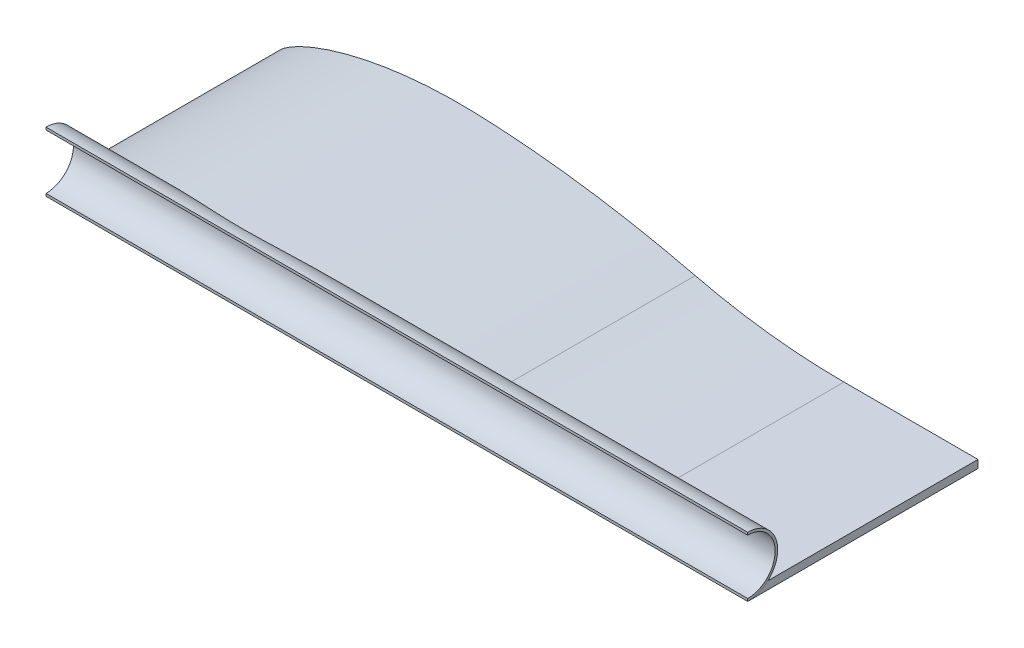
ISO-10303-21;
HEADER;
FILE_DESCRIPTION(('STEP AP214'),'2;1');
FILE_NAME('part.step','',(''),(''),'','','');
FILE_SCHEMA(('AUTOMOTIVE_DESIGN { 1 0 10303 214 1 1 1 1 }'));
ENDSEC;
DATA;
#1=APPLICATION_CONTEXT('core data for automotive mechanical design processes');
#2=APPLICATION_PROTOCOL_DEFINITION('international standard','automotive_design',2000,#1);
#3=PRODUCT_CONTEXT('',#1,'mechanical');
#4=PRODUCT('Part','Part','',(#3));
#5=PRODUCT_RELATED_PRODUCT_CATEGORY('part','',(#4));
#6=PRODUCT_DEFINITION_FORMATION('','',#4);
#7=PRODUCT_DEFINITION_CONTEXT('part definition',#1,'design');
#8=PRODUCT_DEFINITION('design','',#6,#7);
#9=PRODUCT_DEFINITION_SHAPE('','',#8);
#10=(LENGTH_UNIT() NAMED_UNIT(*) SI_UNIT(.MILLI.,.METRE.));
#11=(NAMED_UNIT(*) PLANE_ANGLE_UNIT() SI_UNIT($,.RADIAN.));
#12=(NAMED_UNIT(*) SI_UNIT($,.STERADIAN.) SOLID_ANGLE_UNIT());
#13=UNCERTAINTY_MEASURE_WITH_UNIT(LENGTH_MEASURE(1.E-05),#10,'distance_accuracy_value','');
#14=(GEOMETRIC_REPRESENTATION_CONTEXT(3) GLOBAL_UNCERTAINTY_ASSIGNED_CONTEXT((#13)) GLOBAL_UNIT_ASSIGNED_CONTEXT((#10,
#11,#12)) REPRESENTATION_CONTEXT('',''));
#15=CARTESIAN_POINT('',(0.,0.,0.));
#16=DIRECTION('',(0.,0.,1.));
#17=DIRECTION('',(1.,0.,0.));
#18=AXIS2_PLACEMENT_3D('',#15,#16,#17);
#19=CARTESIAN_POINT('',(0.,0.,185.42));
#20=DIRECTION('',(0.,0.,1.));
#21=DIRECTION('',(1.,0.,0.));
#22=AXIS2_PLACEMENT_3D('',#19,#20,#21);
#23=PLANE('',#22);
#24=DIRECTION('',(1.,0.,0.));
#25=VECTOR('',#24,1.);
#26=CARTESIAN_POINT('',(-52.6289643327547,-1.55200593643312,185.42));
#27=LINE('',#26,#25);
#28=CARTESIAN_POINT('',(-1.16956159429626,-1.55200593643312,185.42));
#29=VERTEX_POINT('',#28);
#30=CARTESIAN_POINT('',(563.880012,-1.55200593643312,185.42));
#31=VERTEX_POINT('',#30);
#32=EDGE_CURVE('E105',#29,#31,#27,.T.);
#33=ORIENTED_EDGE('',*,*,#32,.F.);
#34=DIRECTION('',(0.,1.,0.));
#35=VECTOR('',#34,1.);
#36=CARTESIAN_POINT('',(-1.16956159429626,0.,185.42));
#37=LINE('',#36,#35);
#38=CARTESIAN_POINT('',(-1.16956159429626,-3.58400593643312,185.42));
#39=VERTEX_POINT('',#38);
#40=EDGE_CURVE('E194',#39,#29,#37,.T.);
#41=ORIENTED_EDGE('',*,*,#40,.F.);
#42=DIRECTION('',(1.,0.,0.));
#43=VECTOR('',#42,1.);
#44=CARTESIAN_POINT('',(-1.16956159429626,-3.58400593643312,185.42));
#45=LINE('',#44,#43);
#46=CARTESIAN_POINT('',(16.8244862805456,-3.58400593643312,185.42));
#47=VERTEX_POINT('',#46);
#48=EDGE_CURVE('E190',#39,#47,#45,.T.);
#49=ORIENTED_EDGE('',*,*,#48,.T.);
#50=DIRECTION('',(1.,0.,0.));
#51=VECTOR('',#50,1.);
#52=CARTESIAN_POINT('',(0.,-3.58400593643312,185.42));
#53=LINE('',#52,#51);
#54=CARTESIAN_POINT('',(563.880006,-3.58400593643313,185.42));
#55=VERTEX_POINT('',#54);
#56=EDGE_CURVE('E125',#47,#55,#53,.T.);
#57=ORIENTED_EDGE('',*,*,#56,.T.);
#58=DIRECTION('',(0.,1.,0.));
#59=VECTOR('',#58,1.);
#60=CARTESIAN_POINT('',(563.880012,0.,185.42));
#61=LINE('',#60,#59);
#62=EDGE_CURVE('E119',#55,#31,#61,.T.);
#63=ORIENTED_EDGE('',*,*,#62,.T.);
#64=EDGE_LOOP('',(#33,#41,#49,#57,#63));
#65=FACE_BOUND('',#64,.T.);
#66=ADVANCED_FACE('F35',(#65),#23,.T.);
#67=CARTESIAN_POINT('',(0.,2.76599406356662,185.42));
#68=DIRECTION('',(0.,-1.,0.));
#69=DIRECTION('',(1.,0.,0.));
#70=AXIS2_PLACEMENT_3D('',#67,#68,#69);
#71=PLANE('',#70);
#72=DIRECTION('',(1.,0.,0.));
#73=VECTOR('',#72,1.);
#74=CARTESIAN_POINT('',(-1.16956159429626,2.76599406356663,169.106554625096));
#75=LINE('',#74,#73);
#76=CARTESIAN_POINT('',(563.88,2.76599406356663,169.106554625096));
#77=VERTEX_POINT('',#76);
#78=CARTESIAN_POINT('',(455.986702340772,2.76599406356692,169.106554625095));
#79=VERTEX_POINT('',#78);
#80=EDGE_CURVE('E129',#77,#79,#75,.F.);
#81=ORIENTED_EDGE('',*,*,#80,.F.);
#82=DIRECTION('',(0.,0.,-1.));
#83=VECTOR('',#82,1.);
#84=CARTESIAN_POINT('',(563.88,2.76599406356688,185.42));
#85=LINE('',#84,#83);
#86=CARTESIAN_POINT('',(563.88,2.76599406356688,0.));
#87=VERTEX_POINT('',#86);
#88=EDGE_CURVE('E220',#77,#87,#85,.T.);
#89=ORIENTED_EDGE('',*,*,#88,.T.);
#90=DIRECTION('',(-1.,0.,0.));
#91=VECTOR('',#90,1.);
#92=CARTESIAN_POINT('',(0.,2.76599406356662,0.));
#93=LINE('',#92,#91);
#94=CARTESIAN_POINT('',(455.986702340772,2.76599406356683,0.));
#95=VERTEX_POINT('',#94);
#96=EDGE_CURVE('E142',#87,#95,#93,.T.);
#97=ORIENTED_EDGE('',*,*,#96,.T.);
#98=DIRECTION('',(0.,0.,1.));
#99=VECTOR('',#98,1.);
#100=CARTESIAN_POINT('',(455.986702340772,2.76599406356683,185.42));
#101=LINE('',#100,#99);
#102=EDGE_CURVE('E215',#95,#79,#101,.T.);
#103=ORIENTED_EDGE('',*,*,#102,.T.);
#104=EDGE_LOOP('',(#81,#89,#97,#103));
#105=FACE_BOUND('',#104,.T.);
#106=ADVANCED_FACE('F153',(#105),#71,.F.);
#107=CARTESIAN_POINT('',(397.402740733893,0.,185.42));
#108=CARTESIAN_POINT('',(397.411698055032,0.038885320403436,185.42));
#109=CARTESIAN_POINT('',(395.109063505421,0.667730492670391,185.42));
#110=CARTESIAN_POINT('',(392.784748718469,1.49199113491221,185.42));
#111=CARTESIAN_POINT('',(387.041714069542,3.20797201327392,185.42));
#112=CARTESIAN_POINT('',(379.954865000334,5.35658969865723,185.42));
#113=CARTESIAN_POINT('',(370.615780699372,8.05897955921893,185.42));
#114=CARTESIAN_POINT('',(359.507412748466,11.1431063312715,185.42));
#115=CARTESIAN_POINT('',(346.598869357543,14.5438713747355,185.42));
#116=CARTESIAN_POINT('',(332.061103090113,18.1288417989651,185.42));
#117=CARTESIAN_POINT('',(316.038892879882,21.8064155050036,185.42));
#118=CARTESIAN_POINT('',(298.691944357754,25.449886624153,185.42));
#119=CARTESIAN_POINT('',(280.209065946268,28.9588443293727,185.42));
#120=CARTESIAN_POINT('',(260.784413321996,32.2270252294116,185.42));
#121=CARTESIAN_POINT('',(240.627196048796,35.1598340983636,185.42));
#122=CARTESIAN_POINT('',(219.959471218607,37.67781805282,185.42));
#123=CARTESIAN_POINT('',(199.01149733823,39.7118853380755,185.42));
#124=CARTESIAN_POINT('',(178.012037109444,41.1804944444643,185.42));
#125=CARTESIAN_POINT('',(157.089436587516,42.139263372195,185.42));
#126=CARTESIAN_POINT('',(136.464680266551,42.2131749394883,185.42));
#127=CARTESIAN_POINT('',(116.414649466667,41.217940478165,185.42));
#128=CARTESIAN_POINT('',(97.30433097571,39.2984877838289,185.42));
#129=CARTESIAN_POINT('',(79.3799866186788,36.5495213442708,185.42));
#130=CARTESIAN_POINT('',(62.8681190648392,33.1147834871376,185.42));
#131=CARTESIAN_POINT('',(47.9655542938233,29.1739071161229,185.42));
#132=CARTESIAN_POINT('',(34.850979219968,24.8995128608497,185.42));
#133=CARTESIAN_POINT('',(23.6592605092071,20.5034094565773,185.42));
#134=CARTESIAN_POINT('',(14.5152980764796,16.1324942141789,185.42));
#135=CARTESIAN_POINT('',(7.44822395064549,12.0104976420917,185.42));
#136=CARTESIAN_POINT('',(2.54712627731124,8.16899422843115,185.42));
#137=CARTESIAN_POINT('',(-0.453384309126816,4.79279174210024,185.42));
#138=CARTESIAN_POINT('',(-1.16956159429625,1.10557529626499,185.42));
#139=CARTESIAN_POINT('',(1.41486830061476,-1.60410388651566,185.42));
#140=CARTESIAN_POINT('',(5.70098263570552,-2.84077269687765,185.42));
#141=CARTESIAN_POINT('',(11.7555244989561,-3.57445206902531,185.42));
#142=CARTESIAN_POINT('',(19.6987641608015,-3.6327457960979,185.42));
#143=CARTESIAN_POINT('',(29.4506872946603,-3.17318046215981,185.42));
#144=CARTESIAN_POINT('',(40.9133147322604,-2.23102229721433,185.42));
#145=CARTESIAN_POINT('',(53.9547343819028,-0.933620653111706,185.42));
#146=CARTESIAN_POINT('',(68.4418443218216,0.603641828697804,185.42));
#147=CARTESIAN_POINT('',(84.2200775935775,2.26179395625605,185.42));
#148=CARTESIAN_POINT('',(101.146412331284,3.90001725460771,185.42));
#149=CARTESIAN_POINT('',(119.057408579271,5.37100954783997,185.42));
#150=CARTESIAN_POINT('',(137.798850975262,6.57353185564482,185.42));
#151=CARTESIAN_POINT('',(157.307672245746,7.34803820882025,185.42));
#152=CARTESIAN_POINT('',(177.401590339587,7.7535348034742,185.42));
#153=CARTESIAN_POINT('',(197.867291710901,8.10629507872485,185.42));
#154=CARTESIAN_POINT('',(218.383935910607,8.25382990528894,185.42));
#155=CARTESIAN_POINT('',(238.720913992722,8.21180933346506,185.42));
#156=CARTESIAN_POINT('',(258.65927683326,7.95581265533055,185.42));
#157=CARTESIAN_POINT('',(277.981187946263,7.50085728926565,185.42));
#158=CARTESIAN_POINT('',(296.474222895194,6.86319583158048,185.42));
#159=CARTESIAN_POINT('',(313.932531106465,6.08399675056258,185.42));
#160=CARTESIAN_POINT('',(330.158311416149,5.19874258601101,185.42));
#161=CARTESIAN_POINT('',(344.958833394524,4.26578253175616,185.42));
#162=CARTESIAN_POINT('',(358.177232855869,3.32463445264578,185.42));
#163=CARTESIAN_POINT('',(369.605973842651,2.44215040704408,185.42));
#164=CARTESIAN_POINT('',(379.256357552193,1.63364963837423,185.42));
#165=CARTESIAN_POINT('',(386.613193972221,1.00338863630718,185.42));
#166=CARTESIAN_POINT('',(392.568540150879,0.420302648445525,185.42));
#167=CARTESIAN_POINT('',(395.032189851431,0.277232580315452,185.42));
#168=CARTESIAN_POINT('',(397.393838715057,-0.0386452432959012,185.42));
#169=CARTESIAN_POINT('',(397.402740733893,0.,185.42));
#170=B_SPLINE_CURVE_WITH_KNOTS('',3,(#107,#108,#109,#110,#111,#112,#113,#114,#115,#116,#117,
#118,#119,#120,#121,#122,#123,#124,#125,#126,#127,#128,#129,#130,#131,#132,#133,#134,#135,#136,
#137,#138,#139,#140,#141,#142,#143,#144,#145,#146,#147,#148,#149,#150,#151,#152,#153,#154,#155,
#156,#157,#158,#159,#160,#161,#162,#163,#164,#165,#166,#167,#168,#169),.UNSPECIFIED.,.T.,.F.,(4,
1,1,1,1,1,1,1,1,1,1,1,1,1,1,1,1,1,1,1,1,1,1,1,1,1,1,1,1,1,1,1,1,1,1,1,1,1,1,1,1,1,1,1,1,1,1,1,1,
1,1,1,1,1,1,1,1,1,1,1,4),(0.,0.00137455348322331,0.00548449728179396,0.0122733609908927,
0.021682195504866,0.0335806119079948,0.0478307427867091,0.0643059527211734,0.082777332043007,
0.103063756455997,0.124929016786915,0.148149110667858,0.172444694611559,0.197572105868171,
0.223268880537162,0.249227774933554,0.275186209349679,0.300900708934774,0.326462938278696,
0.351222485186767,0.374905858971967,0.397269706218861,0.418072413969665,0.437079533175026,
0.454093093767394,0.468919631578705,0.48139171235289,0.491447126518173,0.499023571234557,
0.504293734329401,0.507921918342,0.511539686153778,0.516780527527172,0.524216490268905,
0.533991629403711,0.546033957270731,0.560220284382465,0.576403357410148,0.594370816485922,
0.613951103581465,0.634916884969972,0.657088503485648,0.680229909573905,0.704175481107386,
0.72909036740664,0.754353775526935,0.779667752347888,0.804760119952374,0.829359338708984,
0.853208710008459,0.876041363199166,0.897604065496152,0.917662212410958,0.935969860405553,
0.952309787739252,0.966502759006892,0.978350082728452,0.987731492337842,0.994510920242662,
0.998633932979557,1.),.UNSPECIFIED.);
#171=DIRECTION('',(0.,0.,-1.));
#172=VECTOR('',#171,1.);
#173=SURFACE_OF_LINEAR_EXTRUSION('',#170,#172);
#174=CARTESIAN_POINT('',(336.21803103568,17.0864771967916,161.539283029011));
#175=CARTESIAN_POINT('',(335.437780249943,17.2757644204646,161.511863534873));
#176=CARTESIAN_POINT('',(334.657214541211,17.464093103482,161.486876790603));
#177=CARTESIAN_POINT('',(333.095490141557,17.8388368753126,161.441596352543));
#178=CARTESIAN_POINT('',(332.314331452396,18.0252519697809,161.42130264488));
#179=CARTESIAN_POINT('',(329.969668457196,18.5817158477031,161.367194202811));
#180=CARTESIAN_POINT('',(328.405322557292,18.9488994591967,161.34016413168));
#181=CARTESIAN_POINT('',(325.274298396243,19.6754861046501,161.302963173165));
#182=CARTESIAN_POINT('',(323.707619725699,20.0348875421759,161.292795713236));
#183=CARTESIAN_POINT('',(320.572171296696,20.7457180526098,161.288208846348));
#184=CARTESIAN_POINT('',(319.003401244768,21.0971458458174,161.293791949446));
#185=CARTESIAN_POINT('',(315.864013538494,21.7918122816116,161.319674909328));
#186=CARTESIAN_POINT('',(314.293395719207,22.1350501239534,161.339976198201));
#187=CARTESIAN_POINT('',(311.141886800089,22.8151773024117,161.394498203908));
#188=CARTESIAN_POINT('',(309.560987134852,23.1520207292931,161.428795686285));
#189=CARTESIAN_POINT('',(306.397858783431,23.8174039442358,161.510438770316));
#190=CARTESIAN_POINT('',(304.815630163918,24.1459441258268,161.557783752318));
#191=CARTESIAN_POINT('',(301.650104291215,24.7947314517675,161.66472255779));
#192=CARTESIAN_POINT('',(300.066807204176,25.1149796713707,161.724314784062));
#193=CARTESIAN_POINT('',(296.89940616505,25.7471889334054,161.855012628208));
#194=CARTESIAN_POINT('',(295.315302474069,26.0591518210569,161.926115657062));
#195=CARTESIAN_POINT('',(292.146532218502,26.6747000738358,162.079125797354));
#196=CARTESIAN_POINT('',(290.561866009426,26.9782881555916,162.161029354265));
#197=CARTESIAN_POINT('',(287.19448059099,27.6143599486085,162.345815320785));
#198=CARTESIAN_POINT('',(285.411627483541,27.9457447495862,162.450039952394));
#199=CARTESIAN_POINT('',(281.84469517669,28.597922590884,162.670454259723));
#200=CARTESIAN_POINT('',(280.060615958891,28.9187154685767,162.786644119045));
#201=CARTESIAN_POINT('',(276.491336141932,29.5496379793594,163.030144886648));
#202=CARTESIAN_POINT('',(274.706135538111,29.8597675678198,163.157455841467));
#203=CARTESIAN_POINT('',(267.56439866628,31.0786416986717,163.687215764119));
#204=CARTESIAN_POINT('',(262.20344871317,31.9445554313976,164.130863834038));
#205=CARTESIAN_POINT('',(255.049349438321,33.0339672147566,164.770371265855));
#206=CARTESIAN_POINT('',(253.259752555489,33.30097169105,164.934299779345));
#207=CARTESIAN_POINT('',(249.679627756892,33.824063115189,165.269410028223));
#208=CARTESIAN_POINT('',(247.889099840435,34.0801500549142,165.440591769007));
#209=CARTESIAN_POINT('',(244.307146367711,34.5813595143561,165.789446258636));
#210=CARTESIAN_POINT('',(242.5157208113,34.8264820323191,165.967119008521));
#211=CARTESIAN_POINT('',(238.93024398061,35.3059515824793,166.328359643428));
#212=CARTESIAN_POINT('',(237.13619184107,35.5402879835165,166.511933054049));
#213=CARTESIAN_POINT('',(233.547180237933,35.9978457415093,166.883977716382));
#214=CARTESIAN_POINT('',(231.752220774891,36.2210671052663,167.072448965096));
#215=CARTESIAN_POINT('',(228.16137018703,36.6563063880655,167.453409476521));
#216=CARTESIAN_POINT('',(226.365479062006,36.8683243046453,167.645898740114));
#217=CARTESIAN_POINT('',(222.770246011707,37.2813606585816,168.034233796462));
#218=CARTESIAN_POINT('',(220.970902752225,37.482363453226,168.230083869195));
#219=CARTESIAN_POINT('',(217.371201905939,37.8729401695694,168.623848231668));
#220=CARTESIAN_POINT('',(215.570844319171,38.0625140916829,168.821762521331));
#221=CARTESIAN_POINT('',(211.969011243518,38.4299433460895,169.218323262522));
#222=CARTESIAN_POINT('',(210.167535752775,38.6077986588607,169.416969715268));
#223=CARTESIAN_POINT('',(206.560162704245,38.9518176947632,169.813859278725));
#224=CARTESIAN_POINT('',(204.75426296622,39.1179601478332,170.012101051496));
#225=CARTESIAN_POINT('',(202.04439918073,39.3579348607536,170.307624158379));
#226=CARTESIAN_POINT('',(201.140942642942,39.4363865696056,170.405825223379));
#227=CARTESIAN_POINT('',(199.333670786919,39.5901665100613,170.601367636433));
#228=CARTESIAN_POINT('',(198.429855468713,39.6654947419234,170.698708984556));
#229=CARTESIAN_POINT('',(195.717871356897,39.8868070132679,170.989160869109));
#230=CARTESIAN_POINT('',(193.909150854239,40.0281198287577,171.180700729721));
#231=CARTESIAN_POINT('',(190.295079448347,40.2982802896058,171.557902220927));
#232=CARTESIAN_POINT('',(188.489732458599,40.427160239574,171.743578193369));
#233=CARTESIAN_POINT('',(185.78060758023,40.6116920458634,172.017135800193));
#234=CARTESIAN_POINT('',(184.877377020335,40.671738261281,172.107496083864));
#235=CARTESIAN_POINT('',(183.070548723964,40.7889444547252,172.286405958258));
#236=CARTESIAN_POINT('',(182.16695098743,40.8461044322961,172.374955548697));
#237=CARTESIAN_POINT('',(180.35936130182,40.957572432383,172.550068083619));
#238=CARTESIAN_POINT('',(179.455369342284,41.0118803739253,172.636630971658));
#239=CARTESIAN_POINT('',(177.647022660845,41.1177128836928,172.807649600849));
#240=CARTESIAN_POINT('',(176.742667938789,41.1692374507583,172.892105341122));
#241=CARTESIAN_POINT('',(174.933335444865,41.2692952765926,173.058321548425));
#242=CARTESIAN_POINT('',(174.028357577999,41.317827851341,173.140081397156));
#243=CARTESIAN_POINT('',(172.217921090161,41.4115915342971,173.300084214022));
#244=CARTESIAN_POINT('',(171.312462469457,41.4568226443509,173.378327184124));
#245=CARTESIAN_POINT('',(168.595322385798,41.5871421364233,173.606551651376));
#246=CARTESIAN_POINT('',(166.782823934623,41.6668596319258,173.750033648422));
#247=CARTESIAN_POINT('',(163.155266098217,41.8096775021278,174.012323372093));
#248=CARTESIAN_POINT('',(161.340206624548,41.8727772881213,174.131130224533));
#249=CARTESIAN_POINT('',(158.619162663883,41.9531118959471,174.284671809456));
#250=CARTESIAN_POINT('',(157.714075461504,41.977472389801,174.331676699798));
#251=CARTESIAN_POINT('',(155.903349991721,42.0212052251831,174.416614511439));
#252=CARTESIAN_POINT('',(154.99771172441,42.0405775675517,174.454547434267));
#253=CARTESIAN_POINT('',(153.185986132853,42.0741462015376,174.520599081606));
#254=CARTESIAN_POINT('',(152.279898812109,42.0883425329016,174.54871788148));
#255=CARTESIAN_POINT('',(150.46739181745,42.1113662176938,174.594461553027));
#256=CARTESIAN_POINT('',(149.560972144895,42.120193592861,174.61208646719));
#257=CARTESIAN_POINT('',(147.748026914231,42.1322889093703,174.63626409844));
#258=CARTESIAN_POINT('',(146.841501372902,42.1355573491021,174.642817808124));
#259=CARTESIAN_POINT('',(145.028435462956,42.1363490477795,174.64440375795));
#260=CARTESIAN_POINT('',(144.121895094336,42.1338723055367,174.639435995709));
#261=CARTESIAN_POINT('',(142.311160693198,42.1230014498865,174.617694670173));
#262=CARTESIAN_POINT('',(141.406966239108,42.1146215167402,174.600949398198));
#263=CARTESIAN_POINT('',(139.598954148636,42.0917861749209,174.555544759451));
#264=CARTESIAN_POINT('',(138.695136511666,42.0773307757744,174.526885411362));
#265=CARTESIAN_POINT('',(136.888006052622,42.0421514876891,174.457626757237));
#266=CARTESIAN_POINT('',(135.984693277535,42.0214270894939,174.417026481198));
#267=CARTESIAN_POINT('',(134.178838395294,41.9736248621101,174.324224357157));
#268=CARTESIAN_POINT('',(133.276296289194,41.946547024253,174.272022493326));
#269=CARTESIAN_POINT('',(130.570031673899,41.8558565274538,174.099056990196));
#270=CARTESIAN_POINT('',(128.767647345083,41.7827864267359,173.961932506541));
#271=CARTESIAN_POINT('',(125.166710901385,41.6116405117495,173.650255058902));
#272=CARTESIAN_POINT('',(123.368160450949,41.5135554564256,173.475688266733));
#273=CARTESIAN_POINT('',(119.775855765217,41.2926419276118,173.095971327051));
#274=CARTESIAN_POINT('',(117.982101505191,41.169813581956,172.890821337546));
#275=CARTESIAN_POINT('',(114.399339030708,40.8996259234042,172.456511509963));
#276=CARTESIAN_POINT('',(112.610330927383,40.7522660411663,172.227351114684));
#277=CARTESIAN_POINT('',(109.038750594483,40.4327024525345,171.750397947232));
#278=CARTESIAN_POINT('',(107.25617391491,40.2605220751153,171.502622774795));
#279=CARTESIAN_POINT('',(103.695757916973,39.8907242456593,170.993031239419));
#280=CARTESIAN_POINT('',(101.917918410347,39.693107820351,170.731215443478));
#281=CARTESIAN_POINT('',(98.3668347678393,39.2719190488373,170.19790799894));
#282=CARTESIAN_POINT('',(96.5935904733703,39.0483476109089,169.926416689161));
#283=CARTESIAN_POINT('',(93.72065899357,38.6641512765499,169.481362529045));
#284=CARTESIAN_POINT('',(92.6196060211251,38.5116567824938,169.309553659055));
#285=CARTESIAN_POINT('',(90.4192193531201,38.1962426151009,168.964598211738));
#286=CARTESIAN_POINT('',(89.3198856373871,38.0333230650412,168.791451650251));
#287=CARTESIAN_POINT('',(86.0231005984859,37.5284823089802,168.27107470132));
#288=CARTESIAN_POINT('',(83.8281770518223,37.1706540253761,167.923112295195));
#289=CARTESIAN_POINT('',(79.4433321853862,36.4110302636394,167.231495123287));
#290=CARTESIAN_POINT('',(77.2534165891107,36.009198240959,166.887844206171));
#291=CARTESIAN_POINT('',(72.878237290721,35.1597602945235,166.210885922233));
#292=CARTESIAN_POINT('',(70.6929816139357,34.7121032884914,165.877590650427));
#293=CARTESIAN_POINT('',(66.3268002412731,33.7689097480912,165.227425827773));
#294=CARTESIAN_POINT('',(64.145886008572,33.2733021822293,164.910581747597));
#295=CARTESIAN_POINT('',(60.878677912983,32.4925139411153,164.452672746757));
#296=CARTESIAN_POINT('',(59.7891972605682,32.2257314977953,164.302785786117));
#297=CARTESIAN_POINT('',(57.612557152837,31.6793538267991,164.009691405));
#298=CARTESIAN_POINT('',(56.5253976705791,31.3997587486934,163.866483906589));
#299=CARTESIAN_POINT('',(54.3656035588232,30.8304719829926,163.589160480796));
#300=CARTESIAN_POINT('',(53.292941194619,30.5409260364875,163.45496156506));
#301=CARTESIAN_POINT('',(51.1503100929397,29.9484198728682,163.194879903108));
#302=CARTESIAN_POINT('',(50.0803413585768,29.6454596402627,163.068997166496));
#303=CARTESIAN_POINT('',(47.9428147644204,29.0255535692692,162.826531792101));
#304=CARTESIAN_POINT('',(46.8752583747158,28.7086008249872,162.709953828145));
#305=CARTESIAN_POINT('',(44.7434128467048,28.060330446242,162.487291504145));
#306=CARTESIAN_POINT('',(43.6791237011159,27.7290128438218,162.381207120695));
#307=CARTESIAN_POINT('',(41.5553848316843,27.051776877566,162.180889825308));
#308=CARTESIAN_POINT('',(40.4959310533593,26.7058750918938,162.086643916894));
#309=CARTESIAN_POINT('',(38.3810980026701,25.9985512349397,161.911292944742));
#310=CARTESIAN_POINT('',(37.3257187571774,25.6371290614907,161.830187967523));
#311=CARTESIAN_POINT('',(35.7472947869252,25.0833529031836,161.719692539664));
#312=CARTESIAN_POINT('',(35.2225119504171,24.8970352290262,161.684753931672));
#313=CARTESIAN_POINT('',(34.174157947534,24.5203454629941,161.618781763063));
#314=CARTESIAN_POINT('',(33.6505867814532,24.3299733701356,161.587748203392));
#315=CARTESIAN_POINT('',(32.0818809015673,23.7524986372968,161.500824985419));
#316=CARTESIAN_POINT('',(31.0387266107219,23.3590280215237,161.451110862702));
#317=CARTESIAN_POINT('',(28.9615746342018,22.5544639954716,161.37034374653));
#318=CARTESIAN_POINT('',(27.9275603397863,22.1434183000623,161.339243285895));
#319=CARTESIAN_POINT('',(25.8672490307996,21.3011434203258,161.298132330215));
#320=CARTESIAN_POINT('',(24.8409523695203,20.8699133184619,161.288122794869));
#321=CARTESIAN_POINT('',(23.309095993385,20.2071316268351,161.291370908487));
#322=CARTESIAN_POINT('',(22.80000215415,19.9836674629719,161.295490535916));
#323=CARTESIAN_POINT('',(21.7844109975131,19.5311303459318,161.310288513585));
#324=CARTESIAN_POINT('',(21.2779136931799,19.3020573645582,161.320966896804));
#325=CARTESIAN_POINT('',(19.7629069139656,18.6060400173865,161.363609984301));
#326=CARTESIAN_POINT('',(18.7586975137646,18.1302174745693,161.406182650541));
#327=CARTESIAN_POINT('',(17.1489248596415,17.3413317600723,161.501840018845));
#328=CARTESIAN_POINT('',(16.5388387540946,17.0361931718657,161.544554896095));
#329=CARTESIAN_POINT('',(15.324779983584,16.4158266608953,161.644018215943));
#330=CARTESIAN_POINT('',(14.720808679138,16.1005965550401,161.700769713179));
#331=CARTESIAN_POINT('',(13.5197503661525,15.4598477521655,161.829852013934));
#332=CARTESIAN_POINT('',(12.9226656592989,15.1343257439639,161.902187875791));
#333=CARTESIAN_POINT('',(11.7402453412301,14.4720036796424,162.064501528806));
#334=CARTESIAN_POINT('',(11.1548730245636,14.1352524921836,162.15440950439));
#335=CARTESIAN_POINT('',(9.99649433202381,13.4472400772311,162.355026827866));
#336=CARTESIAN_POINT('',(9.42348482599651,13.0959825898281,162.465730839814));
#337=CARTESIAN_POINT('',(8.29320316607544,12.3774126750888,162.711514567143));
#338=CARTESIAN_POINT('',(7.73592359830059,12.0101080263904,162.846582569619));
#339=CARTESIAN_POINT('',(6.94485560614672,11.467346997542,163.06228757973));
#340=CARTESIAN_POINT('',(6.70328246881363,11.2986246723007,163.131498136633));
#341=CARTESIAN_POINT('',(6.22445794203467,10.9577006023481,163.276020445996));
#342=CARTESIAN_POINT('',(5.98720633120766,10.7854990368284,163.351331884839));
#343=CARTESIAN_POINT('',(5.51762790670757,10.4374469179571,163.508573036206));
#344=CARTESIAN_POINT('',(5.28530095005466,10.2615964708395,163.59050255625));
#345=CARTESIAN_POINT('',(4.8253765561938,9.90554782034867,163.761815154115));
#346=CARTESIAN_POINT('',(4.59779857196427,9.72533652770542,163.851223373808));
#347=CARTESIAN_POINT('',(4.1488771514808,9.36118406136133,164.037792953742));
#348=CARTESIAN_POINT('',(3.92753379772601,9.17724283835987,164.134954416512));
#349=CARTESIAN_POINT('',(3.4917521847625,8.80575291730745,164.337580807136));
#350=CARTESIAN_POINT('',(3.27731395481934,8.61820420397246,164.443045770176));
#351=CARTESIAN_POINT('',(2.97992054445334,8.35104815348897,164.59817694879));
#352=CARTESIAN_POINT('',(2.89379887512647,8.27281962009572,164.644186229082));
#353=CARTESIAN_POINT('',(2.72288956614371,8.11582055489012,164.737736150808));
#354=CARTESIAN_POINT('',(2.63810192093462,8.03705002533592,164.785276785865));
#355=CARTESIAN_POINT('',(2.46991131960253,7.87898496416971,164.881928997423));
#356=CARTESIAN_POINT('',(2.3865084449894,7.79969040209365,164.931040665902));
#357=CARTESIAN_POINT('',(2.22110765885437,7.64063379658311,165.03085104003));
#358=CARTESIAN_POINT('',(2.13910976091699,7.56087174863857,165.08154976101));
#359=CARTESIAN_POINT('',(1.97668819417749,7.40076565877638,165.184661023924));
#360=CARTESIAN_POINT('',(1.89626521165705,7.32042138316054,165.237074287536));
#361=CARTESIAN_POINT('',(1.73738283815488,7.15903229216848,165.343757687632));
#362=CARTESIAN_POINT('',(1.65892342204807,7.07798748577387,165.398027800333));
#363=CARTESIAN_POINT('',(1.42781729934554,6.83452486119956,165.563240909832));
#364=CARTESIAN_POINT('',(1.27853103816,6.67088991927184,165.677157612449));
#365=CARTESIAN_POINT('',(0.991616676738478,6.34000909027072,165.913892923642));
#366=CARTESIAN_POINT('',(0.85398251645164,6.17276513768627,166.036706842486));
#367=CARTESIAN_POINT('',(0.592744307025804,5.83488206091928,166.291882993851));
#368=CARTESIAN_POINT('',(0.469129122176449,5.66424575983251,166.424237509328));
#369=CARTESIAN_POINT('',(0.230543596497373,5.30952574328481,166.707397312091));
#370=CARTESIAN_POINT('',(0.116581957445727,5.12526342563976,166.858837566158));
#371=CARTESIAN_POINT('',(-0.0399265576101287,4.84771557244994,167.094179423256));
#372=CARTESIAN_POINT('',(-0.089700197094353,4.75498575309556,167.174009601252));
#373=CARTESIAN_POINT('',(-0.184384846107099,4.569358177674,167.336327832008));
#374=CARTESIAN_POINT('',(-0.229295829700964,4.47646042071382,167.418815898941));
#375=CARTESIAN_POINT('',(-0.314390466165248,4.29043256956095,167.586622229068));
#376=CARTESIAN_POINT('',(-0.354557913403396,4.19730272917981,167.671948986503));
#377=CARTESIAN_POINT('',(-0.430039165470603,4.01136063283999,167.845047851362));
#378=CARTESIAN_POINT('',(-0.465352932810086,3.91854837933974,167.932819977666));
#379=CARTESIAN_POINT('',(-0.563950712701172,3.64089692631792,168.199650991376));
#380=CARTESIAN_POINT('',(-0.619910969865196,3.45679966588147,168.382263553348));
#381=CARTESIAN_POINT('',(-0.711696782155831,3.09140005472407,168.756782691732));
#382=CARTESIAN_POINT('',(-0.747433219380195,2.91011344638453,168.948726418267));
#383=CARTESIAN_POINT('',(-0.797186276187279,2.55258332870914,169.340064729347));
#384=CARTESIAN_POINT('',(-0.811200407250813,2.37634039944964,169.539460164886));
#385=CARTESIAN_POINT('',(-0.815923088994959,2.03111737358716,169.943358286492));
#386=CARTESIAN_POINT('',(-0.806731628554194,1.86210929710686,170.147835314555));
#387=CARTESIAN_POINT('',(-0.774277790583977,1.61473332774775,170.457321085289));
#388=CARTESIAN_POINT('',(-0.760351383502121,1.53330628067319,170.560932763636));
#389=CARTESIAN_POINT('',(-0.726002599158202,1.37266678331179,170.768800317862));
#390=CARTESIAN_POINT('',(-0.705580861213195,1.29345411590424,170.873056129351));
#391=CARTESIAN_POINT('',(-0.660596468602101,1.14581358051176,171.070663908051));
#392=CARTESIAN_POINT('',(-0.636711835428502,1.07713946826532,171.163987439389));
#393=CARTESIAN_POINT('',(-0.584079362493367,0.941784459810156,171.350701369091));
#394=CARTESIAN_POINT('',(-0.555331321254054,0.875103646313101,171.444091770064));
#395=CARTESIAN_POINT('',(-0.462374629185047,0.678071117281909,171.724210548064));
#396=CARTESIAN_POINT('',(-0.391457671314326,0.550742789379675,171.910868430882));
#397=CARTESIAN_POINT('',(-0.234382538030241,0.303672188932018,172.283957365858));
#398=CARTESIAN_POINT('',(-0.148160564915614,0.18396463676315,172.470384044799));
#399=CARTESIAN_POINT('',(0.0369158066698892,-0.0475611487030217,172.841833308221));
#400=CARTESIAN_POINT('',(0.135770878315418,-0.159378961089864,173.026855817322));
#401=CARTESIAN_POINT('',(0.357991257077804,-0.389720335515596,173.419533688572));
#402=CARTESIAN_POINT('',(0.482869480361183,-0.507180970896186,173.626953017032));
#403=CARTESIAN_POINT('',(0.744562505966578,-0.732944890466179,174.039360930089));
#404=CARTESIAN_POINT('',(0.88138314442493,-0.841243645854437,174.244348269985));
#405=CARTESIAN_POINT('',(1.16592303502742,-1.04902812918139,174.651337348482));
#406=CARTESIAN_POINT('',(1.31364645473497,-1.14851045474692,174.853337909608));
#407=CARTESIAN_POINT('',(1.62001500163123,-1.33854270331536,175.252758436206));
#408=CARTESIAN_POINT('',(1.77864564381004,-1.42910409880595,175.45018402839));
#409=CARTESIAN_POINT('',(2.10721848153342,-1.60145184165893,175.839145778204));
#410=CARTESIAN_POINT('',(2.27715350677249,-1.68324366711201,176.030685558542));
#411=CARTESIAN_POINT('',(2.62823161808771,-1.83824354444986,176.406450038866));
#412=CARTESIAN_POINT('',(2.80936258573309,-1.91146063736144,176.590682305658));
#413=CARTESIAN_POINT('',(3.10907074390857,-2.02259924240614,176.880139620491));
#414=CARTESIAN_POINT('',(3.2242354574625,-2.06307786199748,176.987943019229));
#415=CARTESIAN_POINT('',(3.45831295914659,-2.14120586602247,177.200469788434));
#416=CARTESIAN_POINT('',(3.57722581643704,-2.17885519820702,177.305193101998));
#417=CARTESIAN_POINT('',(3.81858379174902,-2.2515467174445,177.511710916919));
#418=CARTESIAN_POINT('',(3.94103276181521,-2.28658590009303,177.613501962938));
#419=CARTESIAN_POINT('',(4.18885935241389,-2.35424687301459,177.814272613508));
#420=CARTESIAN_POINT('',(4.3142369656296,-2.38686866932625,177.913252225083));
#421=CARTESIAN_POINT('',(4.56763329094544,-2.4500647378513,178.109131002781));
#422=CARTESIAN_POINT('',(4.69565788309096,-2.48063362036405,178.206024271054));
#423=CARTESIAN_POINT('',(4.88888295993741,-2.5251370350715,178.350181546568));
#424=CARTESIAN_POINT('',(4.95349041484049,-2.53974674930271,178.398037638926));
#425=CARTESIAN_POINT('',(5.08298228419093,-2.56856662090065,178.493495005975));
#426=CARTESIAN_POINT('',(5.14786669912954,-2.58277677755833,178.541096280213));
#427=CARTESIAN_POINT('',(5.34301972649244,-2.62489359052525,178.683776604094));
#428=CARTESIAN_POINT('',(5.47360086479958,-2.6522437722782,178.778593356032));
#429=CARTESIAN_POINT('',(5.73562187474085,-2.70547882861629,178.967439587253));
#430=CARTESIAN_POINT('',(5.86706172495025,-2.73136373960515,179.061469086045));
#431=CARTESIAN_POINT('',(6.26259576012595,-2.80686124354219,179.342285186833));
#432=CARTESIAN_POINT('',(6.52797244496366,-2.85433125423293,179.527849169));
#433=CARTESIAN_POINT('',(7.06448489931337,-2.94421305558053,179.897004284938));
#434=CARTESIAN_POINT('',(7.33565087726062,-2.98657622048471,180.080563298039));
#435=CARTESIAN_POINT('',(7.88085615828695,-3.0659628097378,180.443373536586));
#436=CARTESIAN_POINT('',(8.15488890566295,-3.10299638214513,180.622632392433));
#437=CARTESIAN_POINT('',(8.70591636712506,-3.17208337895714,180.976778897269));
#438=CARTESIAN_POINT('',(8.98290716247197,-3.20414268533517,181.151671500628));
#439=CARTESIAN_POINT('',(9.53987089462284,-3.26364187864854,181.4971367934));
#440=CARTESIAN_POINT('',(9.81984230360669,-3.29108402149402,181.667711557661));
#441=CARTESIAN_POINT('',(10.2419151366214,-3.32905578432776,181.920549431539));
#442=CARTESIAN_POINT('',(10.382968878077,-3.34118188412216,182.004330568989));
#443=CARTESIAN_POINT('',(10.6657181302707,-3.36441438369788,182.170946930615));
#444=CARTESIAN_POINT('',(10.8074136413723,-3.37552078290147,182.253782154255));
#445=CARTESIAN_POINT('',(11.065529948475,-3.39482964334309,182.403631215243));
#446=CARTESIAN_POINT('',(11.1818594192351,-3.40319282808468,182.47078190886));
#447=CARTESIAN_POINT('',(11.4148576754402,-3.41928869446132,182.60456734804));
#448=CARTESIAN_POINT('',(11.5315264601772,-3.42702137741114,182.671202094677));
#449=CARTESIAN_POINT('',(11.8821477904893,-3.44929771603796,182.870348224779));
#450=CARTESIAN_POINT('',(12.1166221314078,-3.46291271341671,183.002047388755));
#451=CARTESIAN_POINT('',(12.5869924213367,-3.4877778734841,183.263171525751));
#452=CARTESIAN_POINT('',(12.8228885289655,-3.49902776709307,183.392596238472));
#453=CARTESIAN_POINT('',(13.2952705274631,-3.51923785282056,183.648577022541));
#454=CARTESIAN_POINT('',(13.5317515352775,-3.52820585087558,183.775141486238));
#455=CARTESIAN_POINT('',(14.0060957526166,-3.54401663023783,184.025711185195));
#456=CARTESIAN_POINT('',(14.2439587729114,-3.55085969582329,184.149716760714));
#457=CARTESIAN_POINT('',(14.7211014970848,-3.56254041539932,184.395039289426));
#458=CARTESIAN_POINT('',(14.9603811299531,-3.56737816906095,184.516356375963));
#459=CARTESIAN_POINT('',(15.459233459259,-3.57547715222839,184.765578728808));
#460=CARTESIAN_POINT('',(15.7189240205681,-3.5785847266673,184.893253119705));
#461=CARTESIAN_POINT('',(16.2401066788683,-3.58276973236639,185.145167649107));
#462=CARTESIAN_POINT('',(16.5015994238988,-3.58384639051308,185.269406462059));
#463=CARTESIAN_POINT('',(16.7841235407924,-3.58400045750135,185.401209849376));
#464=CARTESIAN_POINT('',(16.8043023738174,-3.58400593835941,185.410610408853));
#465=CARTESIAN_POINT('',(16.8244862805457,-3.58400593643313,185.42));
#466=B_SPLINE_CURVE_WITH_KNOTS('',3,(#174,#175,#176,#177,#178,#179,#180,#181,#182,#183,#184,
#185,#186,#187,#188,#189,#190,#191,#192,#193,#194,#195,#196,#197,#198,#199,#200,#201,#202,#203,
#204,#205,#206,#207,#208,#209,#210,#211,#212,#213,#214,#215,#216,#217,#218,#219,#220,#221,#222,
#223,#224,#225,#226,#227,#228,#229,#230,#231,#232,#233,#234,#235,#236,#237,#238,#239,#240,#241,
#242,#243,#244,#245,#246,#247,#248,#249,#250,#251,#252,#253,#254,#255,#256,#257,#258,#259,#260,
#261,#262,#263,#264,#265,#266,#267,#268,#269,#270,#271,#272,#273,#274,#275,#276,#277,#278,#279,
#280,#281,#282,#283,#284,#285,#286,#287,#288,#289,#290,#291,#292,#293,#294,#295,#296,#297,#298,
#299,#300,#301,#302,#303,#304,#305,#306,#307,#308,#309,#310,#311,#312,#313,#314,#315,#316,#317,
#318,#319,#320,#321,#322,#323,#324,#325,#326,#327,#328,#329,#330,#331,#332,#333,#334,#335,#336,
#337,#338,#339,#340,#341,#342,#343,#344,#345,#346,#347,#348,#349,#350,#351,#352,#353,#354,#355,
#356,#357,#358,#359,#360,#361,#362,#363,#364,#365,#366,#367,#368,#369,#370,#371,#372,#373,#374,
#375,#376,#377,#378,#379,#380,#381,#382,#383,#384,#385,#386,#387,#388,#389,#390,#391,#392,#393,
#394,#395,#396,#397,#398,#399,#400,#401,#402,#403,#404,#405,#406,#407,#408,#409,#410,#411,#412,
#413,#414,#415,#416,#417,#418,#419,#420,#421,#422,#423,#424,#425,#426,#427,#428,#429,#430,#431,
#432,#433,#434,#435,#436,#437,#438,#439,#440,#441,#442,#443,#444,#445,#446,#447,#448,#449,#450,
#451,#452,#453,#454,#455,#456,#457,#458,#459,#460,#461,#462,#463,#464,#465),.UNSPECIFIED.,.F.,
.F.,(4,2,2,2,2,2,2,2,2,2,2,2,2,2,2,2,2,2,2,2,2,2,2,2,2,2,2,2,2,2,2,2,2,2,2,2,2,2,2,2,2,2,2,2,2,
2,2,2,2,2,2,2,2,2,2,2,2,2,2,2,2,2,2,2,2,2,2,2,2,2,2,2,2,2,2,2,2,2,2,2,2,2,2,2,2,2,2,2,2,2,2,2,2,
2,2,2,2,2,2,2,2,2,2,2,2,2,2,2,2,2,2,2,2,2,2,2,2,2,2,2,2,2,2,2,2,2,2,2,2,2,2,2,2,2,2,2,2,2,2,2,2,
2,2,2,2,4),(0.,2.41004315459584,4.82007918505837,9.64121782088123,14.4633362699124,
19.2862232296764,24.1095795225255,28.9597540669072,33.809698306103,38.6590104506412,
43.5072333950539,48.3538647204853,53.8029377732486,59.2520944517199,64.7012739340518,
81.0449261234372,86.4953591579109,91.9457962463536,97.3962342065272,102.851934044944,
108.307630544928,113.763328243965,119.226582901279,124.689837360418,130.15310092055,
135.626042768449,138.362511146832,141.09897929885,146.571874547092,152.030143139338,
154.759306836427,157.488470964215,160.217712535187,162.946955243375,165.676819606795,
168.406682443815,173.866248888183,179.326008719464,182.045862101349,184.765715025092,
187.485547062611,190.205368087343,192.924945251941,195.644522979104,198.357590092339,
201.070652951398,203.783936262884,206.497223276287,211.923726692376,217.352237685231,
222.780720632872,228.209329585385,233.632869018339,239.056189598238,244.479320450118,
247.853560768492,251.227761193617,257.980178740633,264.738247234285,271.503932894864,
278.279798986987,281.674639734166,285.069440861183,288.426722282243,291.784007580494,
295.142968780957,298.501922489102,301.85715584045,305.212411281871,306.886298976472,
308.560187077255,311.907876661173,315.246992432079,318.58626013921,320.254177248788,
321.922102745049,325.257349459104,327.307574441184,329.358245984748,331.409584136138,
333.452932004392,335.495756295314,337.537601110201,338.445552441324,339.353457128785,
340.261335420415,341.172398947927,342.083474525341,342.9945539636,343.369882364877,
343.745209203341,344.120558056388,344.495910536583,344.871423094872,345.246930845778,
345.993764176037,346.740206674375,347.486052034536,348.278063377345,348.674251434386,
349.070441604366,349.467948376591,349.865458218966,350.660293632977,351.458604812733,
352.257007440692,353.051975766377,353.449369481799,353.846724094978,354.201508796059,
354.556308198508,355.265975598664,355.978673798627,356.69140999169,357.498220240489,
358.305427000661,359.112943927966,359.919408430825,360.725366187523,361.530466358408,
362.018954343608,362.50745134761,362.996502214038,363.485551858775,363.975838944065,
364.220990491794,364.466142474543,364.957157363956,365.448160049054,366.429908838438,
367.420369823903,368.408919189491,369.396290556537,370.3831780918,370.876692549531,
371.370207286866,371.773943615347,372.177679101896,372.985473977001,373.793360705874,
374.598445481033,375.403422503699,376.208359511383,377.076513868079,377.944998640405,
378.011781874052),.UNSPECIFIED.);
#467=CARTESIAN_POINT('',(336.218031035527,17.0864771968284,161.539283029005));
#468=VERTEX_POINT('',#467);
#469=EDGE_CURVE('E127',#468,#47,#466,.T.);
#470=ORIENTED_EDGE('',*,*,#469,.F.);
#471=DIRECTION('',(0.,0.,-1.));
#472=VECTOR('',#471,1.);
#473=CARTESIAN_POINT('',(336.218031035528,17.0864771968285,185.42));
#474=LINE('',#473,#472);
#475=CARTESIAN_POINT('',(336.218031035531,17.0864771968276,0.));
#476=VERTEX_POINT('',#475);
#477=EDGE_CURVE('E209',#468,#476,#474,.T.);
#478=ORIENTED_EDGE('',*,*,#477,.T.);
#479=CARTESIAN_POINT('',(397.402740733893,0.,0.));
#480=CARTESIAN_POINT('',(397.411698055032,0.038885320403436,0.));
#481=CARTESIAN_POINT('',(395.109063505421,0.667730492670391,0.));
#482=CARTESIAN_POINT('',(392.784748718469,1.49199113491221,0.));
#483=CARTESIAN_POINT('',(387.041714069542,3.20797201327392,0.));
#484=CARTESIAN_POINT('',(379.954865000334,5.35658969865723,0.));
#485=CARTESIAN_POINT('',(370.615780699372,8.05897955921893,0.));
#486=CARTESIAN_POINT('',(359.507412748466,11.1431063312715,0.));
#487=CARTESIAN_POINT('',(346.598869357543,14.5438713747355,0.));
#488=CARTESIAN_POINT('',(332.061103090113,18.1288417989651,0.));
#489=CARTESIAN_POINT('',(316.038892879882,21.8064155050036,0.));
#490=CARTESIAN_POINT('',(298.691944357754,25.449886624153,0.));
#491=CARTESIAN_POINT('',(280.209065946268,28.9588443293727,0.));
#492=CARTESIAN_POINT('',(260.784413321996,32.2270252294116,0.));
#493=CARTESIAN_POINT('',(240.627196048796,35.1598340983636,0.));
#494=CARTESIAN_POINT('',(219.959471218607,37.67781805282,0.));
#495=CARTESIAN_POINT('',(199.01149733823,39.7118853380755,0.));
#496=CARTESIAN_POINT('',(178.012037109444,41.1804944444643,0.));
#497=CARTESIAN_POINT('',(157.089436587516,42.139263372195,0.));
#498=CARTESIAN_POINT('',(136.464680266551,42.2131749394883,0.));
#499=CARTESIAN_POINT('',(116.414649466667,41.217940478165,0.));
#500=CARTESIAN_POINT('',(97.30433097571,39.2984877838289,0.));
#501=CARTESIAN_POINT('',(79.3799866186788,36.5495213442708,0.));
#502=CARTESIAN_POINT('',(62.8681190648392,33.1147834871376,0.));
#503=CARTESIAN_POINT('',(47.9655542938233,29.1739071161229,0.));
#504=CARTESIAN_POINT('',(34.850979219968,24.8995128608497,0.));
#505=CARTESIAN_POINT('',(23.6592605092071,20.5034094565773,0.));
#506=CARTESIAN_POINT('',(14.5152980764796,16.1324942141789,0.));
#507=CARTESIAN_POINT('',(7.44822395064549,12.0104976420917,0.));
#508=CARTESIAN_POINT('',(2.54712627731124,8.16899422843115,0.));
#509=CARTESIAN_POINT('',(-0.453384309126816,4.79279174210024,0.));
#510=CARTESIAN_POINT('',(-1.16956159429625,1.10557529626499,0.));
#511=CARTESIAN_POINT('',(1.41486830061476,-1.60410388651566,0.));
#512=CARTESIAN_POINT('',(5.70098263570552,-2.84077269687765,0.));
#513=CARTESIAN_POINT('',(11.7555244989561,-3.57445206902531,0.));
#514=CARTESIAN_POINT('',(19.6987641608015,-3.6327457960979,0.));
#515=CARTESIAN_POINT('',(29.4506872946603,-3.17318046215981,0.));
#516=CARTESIAN_POINT('',(40.9133147322604,-2.23102229721433,0.));
#517=CARTESIAN_POINT('',(53.9547343819028,-0.933620653111706,0.));
#518=CARTESIAN_POINT('',(68.4418443218216,0.603641828697804,0.));
#519=CARTESIAN_POINT('',(84.2200775935775,2.26179395625605,0.));
#520=CARTESIAN_POINT('',(101.146412331284,3.90001725460771,0.));
#521=CARTESIAN_POINT('',(119.057408579271,5.37100954783997,0.));
#522=CARTESIAN_POINT('',(137.798850975262,6.57353185564482,0.));
#523=CARTESIAN_POINT('',(157.307672245746,7.34803820882025,0.));
#524=CARTESIAN_POINT('',(177.401590339587,7.7535348034742,0.));
#525=CARTESIAN_POINT('',(197.867291710901,8.10629507872485,0.));
#526=CARTESIAN_POINT('',(218.383935910607,8.25382990528894,0.));
#527=CARTESIAN_POINT('',(238.720913992722,8.21180933346506,0.));
#528=CARTESIAN_POINT('',(258.65927683326,7.95581265533055,0.));
#529=CARTESIAN_POINT('',(277.981187946263,7.50085728926565,0.));
#530=CARTESIAN_POINT('',(296.474222895194,6.86319583158048,0.));
#531=CARTESIAN_POINT('',(313.932531106465,6.08399675056258,0.));
#532=CARTESIAN_POINT('',(330.158311416149,5.19874258601101,0.));
#533=CARTESIAN_POINT('',(344.958833394524,4.26578253175616,0.));
#534=CARTESIAN_POINT('',(358.177232855869,3.32463445264578,0.));
#535=CARTESIAN_POINT('',(369.605973842651,2.44215040704408,0.));
#536=CARTESIAN_POINT('',(379.256357552193,1.63364963837423,0.));
#537=CARTESIAN_POINT('',(386.613193972221,1.00338863630718,0.));
#538=CARTESIAN_POINT('',(392.568540150879,0.420302648445525,0.));
#539=CARTESIAN_POINT('',(395.032189851431,0.277232580315452,0.));
#540=CARTESIAN_POINT('',(397.393838715057,-0.0386452432959012,0.));
#541=CARTESIAN_POINT('',(397.402740733893,0.,0.));
#542=B_SPLINE_CURVE_WITH_KNOTS('',3,(#479,#480,#481,#482,#483,#484,#485,#486,#487,#488,#489,
#490,#491,#492,#493,#494,#495,#496,#497,#498,#499,#500,#501,#502,#503,#504,#505,#506,#507,#508,
#509,#510,#511,#512,#513,#514,#515,#516,#517,#518,#519,#520,#521,#522,#523,#524,#525,#526,#527,
#528,#529,#530,#531,#532,#533,#534,#535,#536,#537,#538,#539,#540,#541),.UNSPECIFIED.,.T.,.F.,(4,
1,1,1,1,1,1,1,1,1,1,1,1,1,1,1,1,1,1,1,1,1,1,1,1,1,1,1,1,1,1,1,1,1,1,1,1,1,1,1,1,1,1,1,1,1,1,1,1,
1,1,1,1,1,1,1,1,1,1,1,4),(0.,0.00137455348322331,0.00548449728179396,0.0122733609908927,
0.021682195504866,0.0335806119079948,0.0478307427867091,0.0643059527211734,0.082777332043007,
0.103063756455997,0.124929016786915,0.148149110667858,0.172444694611559,0.197572105868171,
0.223268880537162,0.249227774933554,0.275186209349679,0.300900708934774,0.326462938278696,
0.351222485186767,0.374905858971967,0.397269706218861,0.418072413969665,0.437079533175026,
0.454093093767394,0.468919631578705,0.48139171235289,0.491447126518173,0.499023571234557,
0.504293734329401,0.507921918342,0.511539686153778,0.516780527527172,0.524216490268905,
0.533991629403711,0.546033957270731,0.560220284382465,0.576403357410148,0.594370816485922,
0.613951103581465,0.634916884969972,0.657088503485648,0.680229909573905,0.704175481107386,
0.72909036740664,0.754353775526935,0.779667752347888,0.804760119952374,0.829359338708984,
0.853208710008459,0.876041363199166,0.897604065496152,0.917662212410958,0.935969860405553,
0.952309787739252,0.966502759006892,0.978350082728452,0.987731492337842,0.994510920242662,
0.998633932979557,1.),.UNSPECIFIED.);
#543=CARTESIAN_POINT('',(16.8244862805457,-3.58400593643312,0.));
#544=VERTEX_POINT('',#543);
#545=EDGE_CURVE('E226',#476,#544,#542,.T.);
#546=ORIENTED_EDGE('',*,*,#545,.T.);
#547=DIRECTION('',(0.,0.,-1.));
#548=VECTOR('',#547,1.);
#549=CARTESIAN_POINT('',(16.8244862805457,-3.58400593643312,185.42));
#550=LINE('',#549,#548);
#551=EDGE_CURVE('E211',#47,#544,#550,.T.);
#552=ORIENTED_EDGE('',*,*,#551,.F.);
#553=EDGE_LOOP('',(#470,#478,#546,#552));
#554=FACE_BOUND('',#553,.T.);
#555=ADVANCED_FACE('F148',(#554),#173,.F.);
#556=CARTESIAN_POINT('',(563.88,0.,185.42));
#557=DIRECTION('',(-1.,0.,0.));
#558=DIRECTION('',(0.,0.,1.));
#559=AXIS2_PLACEMENT_3D('',#556,#557,#558);
#560=PLANE('',#559);
#561=CARTESIAN_POINT('',(563.88,20.5459940635669,185.42));
#562=DIRECTION('',(-1.,0.,0.));
#563=DIRECTION('',(0.,0.,1.));
#564=AXIS2_PLACEMENT_3D('',#561,#562,#563);
#565=CIRCLE('',#564,24.13);
#566=EDGE_CURVE('E189',#55,#77,#565,.F.);
#567=ORIENTED_EDGE('',*,*,#566,.F.);
#568=DIRECTION('',(0.,0.,-1.));
#569=VECTOR('',#568,1.);
#570=CARTESIAN_POINT('',(563.88,-3.58400593643312,185.42));
#571=LINE('',#570,#569);
#572=CARTESIAN_POINT('',(563.88,-3.58400593643312,0.));
#573=VERTEX_POINT('',#572);
#574=EDGE_CURVE('E217',#55,#573,#571,.T.);
#575=ORIENTED_EDGE('',*,*,#574,.T.);
#576=DIRECTION('',(0.,1.,0.));
#577=VECTOR('',#576,1.);
#578=CARTESIAN_POINT('',(563.88,0.,0.));
#579=LINE('',#578,#577);
#580=EDGE_CURVE('E222',#573,#87,#579,.T.);
#581=ORIENTED_EDGE('',*,*,#580,.T.);
#582=ORIENTED_EDGE('',*,*,#88,.F.);
#583=EDGE_LOOP('',(#567,#575,#581,#582));
#584=FACE_BOUND('',#583,.T.);
#585=ADVANCED_FACE('F152',(#584),#560,.F.);
#586=CARTESIAN_POINT('',(455.986702340772,510.765994063567,92.71));
#587=DIRECTION('',(0.,0.,-1.));
#588=DIRECTION('',(-1.,0.,0.));
#589=AXIS2_PLACEMENT_3D('',#586,#587,#588);
#590=CYLINDRICAL_SURFACE('',#589,508.);
#591=CARTESIAN_POINT('',(455.986702340772,2.76599406356692,169.106554625095));
#592=CARTESIAN_POINT('',(454.976692210699,2.76599396464067,169.10656054719));
#593=CARTESIAN_POINT('',(453.966687481735,2.76900626153917,169.103270907828));
#594=CARTESIAN_POINT('',(451.946758227884,2.78105441941296,169.090152037039));
#595=CARTESIAN_POINT('',(450.936833702855,2.79009026930304,169.080322817647));
#596=CARTESIAN_POINT('',(447.907351569367,2.82623045754642,169.041104007097));
#597=CARTESIAN_POINT('',(445.888012771919,2.86236743465702,169.001983256565));
#598=CARTESIAN_POINT('',(441.851263408638,2.95868395101311,168.898851280248));
#599=CARTESIAN_POINT('',(439.833852416766,3.01885513899372,168.834848700459));
#600=CARTESIAN_POINT('',(435.800752229542,3.16319744276367,168.683626718504));
#601=CARTESIAN_POINT('',(433.785063045404,3.24736871367803,168.596407166276));
#602=CARTESIAN_POINT('',(429.76184423078,3.43937289310614,168.401213896302));
#603=CARTESIAN_POINT('',(427.754308159184,3.54713470457291,168.293302657792));
#604=CARTESIAN_POINT('',(423.741752568375,3.78640594382849,168.059093426768));
#605=CARTESIAN_POINT('',(421.736733042604,3.91791530961055,167.932795482263));
#606=CARTESIAN_POINT('',(415.725284014666,4.34802189551159,167.530421689942));
#607=CARTESIAN_POINT('',(411.722901533494,4.68217670911747,167.230888277798));
#608=CARTESIAN_POINT('',(404.724845002943,5.35001114118515,166.672247994965));
#609=CARTESIAN_POINT('',(401.726476700296,5.66312069374024,166.421626928679));
#610=CARTESIAN_POINT('',(395.73673427886,6.34253516749553,165.908466874066));
#611=CARTESIAN_POINT('',(392.745360260303,6.70884084634246,165.645927716032));
#612=CARTESIAN_POINT('',(386.769910472349,7.49457985565351,165.11873645475));
#613=CARTESIAN_POINT('',(383.785834433639,7.91401119455131,164.854084431057));
#614=CARTESIAN_POINT('',(377.824964590624,8.80601103052743,164.332165700767));
#615=CARTESIAN_POINT('',(374.848170811454,9.27857971073804,164.074899019627));
#616=CARTESIAN_POINT('',(368.887621514181,10.2793039582769,163.575866755046));
#617=CARTESIAN_POINT('',(365.90390268041,10.8077189973678,163.334182753448));
#618=CARTESIAN_POINT('',(359.944475082512,11.9182447413622,162.877163354797));
#619=CARTESIAN_POINT('',(356.968766103529,12.5003539908954,162.661827243957));
#620=CARTESIAN_POINT('',(352.511234505006,13.4138763041188,162.365884555431));
#621=CARTESIAN_POINT('',(351.026158815086,13.7251631863677,162.271734340814));
#622=CARTESIAN_POINT('',(348.058265535897,14.3611635914326,162.093752505559));
#623=CARTESIAN_POINT('',(346.575447935241,14.6858770463032,162.009920832714));
#624=CARTESIAN_POINT('',(343.612045465743,15.34875376843,161.853888928352));
#625=CARTESIAN_POINT('',(342.131460840712,15.6869184075972,161.781689887082));
#626=CARTESIAN_POINT('',(339.172809940326,16.3766514940752,161.650343858916));
#627=CARTESIAN_POINT('',(337.694743712317,16.7282201905419,161.591197114776));
#628=CARTESIAN_POINT('',(336.218031035527,17.0864771968285,161.539283029005));
#629=B_SPLINE_CURVE_WITH_KNOTS('',3,(#591,#592,#593,#594,#595,#596,#597,#598,#599,#600,#601,
#602,#603,#604,#605,#606,#607,#608,#609,#610,#611,#612,#613,#614,#615,#616,#617,#618,#619,#620,
#621,#622,#623,#624,#625,#626,#627,#628),.UNSPECIFIED.,.F.,.F.,(4,2,2,2,2,2,2,2,2,2,2,2,2,2,2,2,
2,2,4),(0.,3.03000987773695,6.06001417933085,12.1198049213559,18.1774918724603,24.2352179784334,
30.2749327018545,36.3146316553298,48.3953446994232,57.470111834069,66.5450082289187,
75.6195645261246,84.6941520987974,93.81292783788,102.931456487056,107.49218051491,
112.052881466005,116.614048770133,121.175300899017),.UNSPECIFIED.);
#630=EDGE_CURVE('E46',#79,#468,#629,.T.);
#631=ORIENTED_EDGE('',*,*,#630,.F.);
#632=ORIENTED_EDGE('',*,*,#102,.F.);
#633=CARTESIAN_POINT('',(455.986702340772,510.765994063567,0.));
#634=DIRECTION('',(0.,0.,1.));
#635=DIRECTION('',(1.,0.,0.));
#636=AXIS2_PLACEMENT_3D('',#633,#634,#635);
#637=CIRCLE('',#636,508.);
#638=EDGE_CURVE('E60',#476,#95,#637,.T.);
#639=ORIENTED_EDGE('',*,*,#638,.F.);
#640=ORIENTED_EDGE('',*,*,#477,.F.);
#641=EDGE_LOOP('',(#631,#632,#639,#640));
#642=FACE_BOUND('',#641,.T.);
#643=ADVANCED_FACE('F37',(#642),#590,.F.);
#644=CARTESIAN_POINT('',(0.,-3.58400593643312,185.42));
#645=DIRECTION('',(0.,1.,0.));
#646=DIRECTION('',(-1.,0.,0.));
#647=AXIS2_PLACEMENT_3D('',#644,#645,#646);
#648=PLANE('',#647);
#649=DIRECTION('',(1.,0.,0.));
#650=VECTOR('',#649,1.);
#651=CARTESIAN_POINT('',(0.,-3.58400593643312,0.));
#652=LINE('',#651,#650);
#653=EDGE_CURVE('E225',#544,#573,#652,.T.);
#654=ORIENTED_EDGE('',*,*,#653,.T.);
#655=ORIENTED_EDGE('',*,*,#574,.F.);
#656=ORIENTED_EDGE('',*,*,#56,.F.);
#657=ORIENTED_EDGE('',*,*,#551,.T.);
#658=EDGE_LOOP('',(#654,#655,#656,#657));
#659=FACE_BOUND('',#658,.T.);
#660=ADVANCED_FACE('F155',(#659),#648,.F.);
#661=DIRECTION('',(1.,0.,0.));
#662=VECTOR('',#661,1.);
#663=CARTESIAN_POINT('',(-52.6289643327547,42.6439940635669,185.42));
#664=LINE('',#663,#662);
#665=CARTESIAN_POINT('',(-1.16956159429626,42.6439940635669,185.42));
#666=VERTEX_POINT('',#665);
#667=CARTESIAN_POINT('',(563.880012,42.6439940635669,185.42));
#668=VERTEX_POINT('',#667);
#669=EDGE_CURVE('E53',#666,#668,#664,.T.);
#670=ORIENTED_EDGE('',*,*,#669,.T.);
#671=CARTESIAN_POINT('',(563.880012,44.6759940635669,185.42));
#672=VERTEX_POINT('',#671);
#673=EDGE_CURVE('E40',#668,#672,#61,.T.);
#674=ORIENTED_EDGE('',*,*,#673,.T.);
#675=DIRECTION('',(1.,0.,0.));
#676=VECTOR('',#675,1.);
#677=CARTESIAN_POINT('',(-1.16956159429626,44.6759940635669,185.42));
#678=LINE('',#677,#676);
#679=CARTESIAN_POINT('',(-1.16956159429626,44.6759940635669,185.42));
#680=VERTEX_POINT('',#679);
#681=EDGE_CURVE('E164',#680,#672,#678,.T.);
#682=ORIENTED_EDGE('',*,*,#681,.F.);
#683=EDGE_CURVE('E197',#666,#680,#37,.T.);
#684=ORIENTED_EDGE('',*,*,#683,.F.);
#685=EDGE_LOOP('',(#670,#674,#682,#684));
#686=FACE_BOUND('',#685,.T.);
#687=ADVANCED_FACE('F202',(#686),#23,.T.);
#688=CARTESIAN_POINT('',(0.,0.,0.));
#689=DIRECTION('',(0.,0.,1.));
#690=DIRECTION('',(1.,0.,0.));
#691=AXIS2_PLACEMENT_3D('',#688,#689,#690);
#692=PLANE('',#691);
#693=ORIENTED_EDGE('',*,*,#96,.F.);
#694=ORIENTED_EDGE('',*,*,#580,.F.);
#695=ORIENTED_EDGE('',*,*,#653,.F.);
#696=ORIENTED_EDGE('',*,*,#545,.F.);
#697=ORIENTED_EDGE('',*,*,#638,.T.);
#698=EDGE_LOOP('',(#693,#694,#695,#696,#697));
#699=FACE_BOUND('',#698,.T.);
#700=ADVANCED_FACE('F172',(#699),#692,.F.);
#701=CARTESIAN_POINT('',(-1.16956159429626,20.5459940635669,185.42));
#702=DIRECTION('',(1.,0.,0.));
#703=DIRECTION('',(0.,0.,-1.));
#704=AXIS2_PLACEMENT_3D('',#701,#702,#703);
#705=CYLINDRICAL_SURFACE('',#704,24.13);
#706=CARTESIAN_POINT('',(563.880012,20.5459940635669,185.42));
#707=DIRECTION('',(1.,0.,0.));
#708=DIRECTION('',(0.,0.,-1.));
#709=AXIS2_PLACEMENT_3D('',#706,#707,#708);
#710=CIRCLE('',#709,24.13);
#711=EDGE_CURVE('E131',#672,#55,#710,.F.);
#712=ORIENTED_EDGE('',*,*,#711,.T.);
#713=ORIENTED_EDGE('',*,*,#566,.T.);
#714=ORIENTED_EDGE('',*,*,#80,.T.);
#715=ORIENTED_EDGE('',*,*,#630,.T.);
#716=ORIENTED_EDGE('',*,*,#469,.T.);
#717=ORIENTED_EDGE('',*,*,#48,.F.);
#718=CARTESIAN_POINT('',(-1.16956159429626,20.5459940635669,185.42));
#719=DIRECTION('',(1.,0.,0.));
#720=DIRECTION('',(0.,0.,-1.));
#721=AXIS2_PLACEMENT_3D('',#718,#719,#720);
#722=CIRCLE('',#721,24.13);
#723=EDGE_CURVE('E112',#680,#39,#722,.F.);
#724=ORIENTED_EDGE('',*,*,#723,.F.);
#725=ORIENTED_EDGE('',*,*,#681,.T.);
#726=EDGE_LOOP('',(#712,#713,#714,#715,#716,#717,#724,#725));
#727=FACE_BOUND('',#726,.T.);
#728=ADVANCED_FACE('F167',(#727),#705,.T.);
#729=CARTESIAN_POINT('',(563.880012,0.,0.));
#730=DIRECTION('',(1.,0.,0.));
#731=DIRECTION('',(0.,0.,-1.));
#732=AXIS2_PLACEMENT_3D('',#729,#730,#731);
#733=PLANE('',#732);
#734=CARTESIAN_POINT('',(563.880012,20.5459940635669,185.42));
#735=DIRECTION('',(1.,0.,0.));
#736=DIRECTION('',(0.,0.,-1.));
#737=AXIS2_PLACEMENT_3D('',#734,#735,#736);
#738=CIRCLE('',#737,22.098);
#739=EDGE_CURVE('E108',#31,#668,#738,.T.);
#740=ORIENTED_EDGE('',*,*,#739,.F.);
#741=ORIENTED_EDGE('',*,*,#62,.F.);
#742=ORIENTED_EDGE('',*,*,#711,.F.);
#743=ORIENTED_EDGE('',*,*,#673,.F.);
#744=EDGE_LOOP('',(#740,#741,#742,#743));
#745=FACE_BOUND('',#744,.T.);
#746=ADVANCED_FACE('F117',(#745),#733,.T.);
#747=CARTESIAN_POINT('',(-1.16956159429626,0.,0.));
#748=DIRECTION('',(1.,0.,0.));
#749=DIRECTION('',(0.,0.,-1.));
#750=AXIS2_PLACEMENT_3D('',#747,#748,#749);
#751=PLANE('',#750);
#752=ORIENTED_EDGE('',*,*,#40,.T.);
#753=CARTESIAN_POINT('',(-1.16956159429626,20.5459940635669,185.42));
#754=DIRECTION('',(1.,0.,0.));
#755=DIRECTION('',(0.,0.,-1.));
#756=AXIS2_PLACEMENT_3D('',#753,#754,#755);
#757=CIRCLE('',#756,22.098);
#758=EDGE_CURVE('E11',#29,#666,#757,.T.);
#759=ORIENTED_EDGE('',*,*,#758,.T.);
#760=ORIENTED_EDGE('',*,*,#683,.T.);
#761=ORIENTED_EDGE('',*,*,#723,.T.);
#762=EDGE_LOOP('',(#752,#759,#760,#761));
#763=FACE_BOUND('',#762,.T.);
#764=ADVANCED_FACE('F174',(#763),#751,.F.);
#765=CARTESIAN_POINT('',(-52.6289643327547,20.5459940635669,185.42));
#766=DIRECTION('',(1.,0.,0.));
#767=DIRECTION('',(0.,0.,-1.));
#768=AXIS2_PLACEMENT_3D('',#765,#766,#767);
#769=CYLINDRICAL_SURFACE('',#768,22.098);
#770=ORIENTED_EDGE('',*,*,#32,.T.);
#771=ORIENTED_EDGE('',*,*,#739,.T.);
#772=ORIENTED_EDGE('',*,*,#669,.F.);
#773=ORIENTED_EDGE('',*,*,#758,.F.);
#774=EDGE_LOOP('',(#770,#771,#772,#773));
#775=FACE_BOUND('',#774,.T.);
#776=ADVANCED_FACE('F107',(#775),#769,.F.);
#777=CLOSED_SHELL('',(#66,#106,#555,#585,#643,#660,#687,#700,#728,#746,#764,#776));
#778=MANIFOLD_SOLID_BREP('B2',#777);
#779=ADVANCED_BREP_SHAPE_REPRESENTATION('',(#18,#778),#14);
#780=SHAPE_DEFINITION_REPRESENTATION(#9,#779);
ENDSEC;
END-ISO-10303-21;
